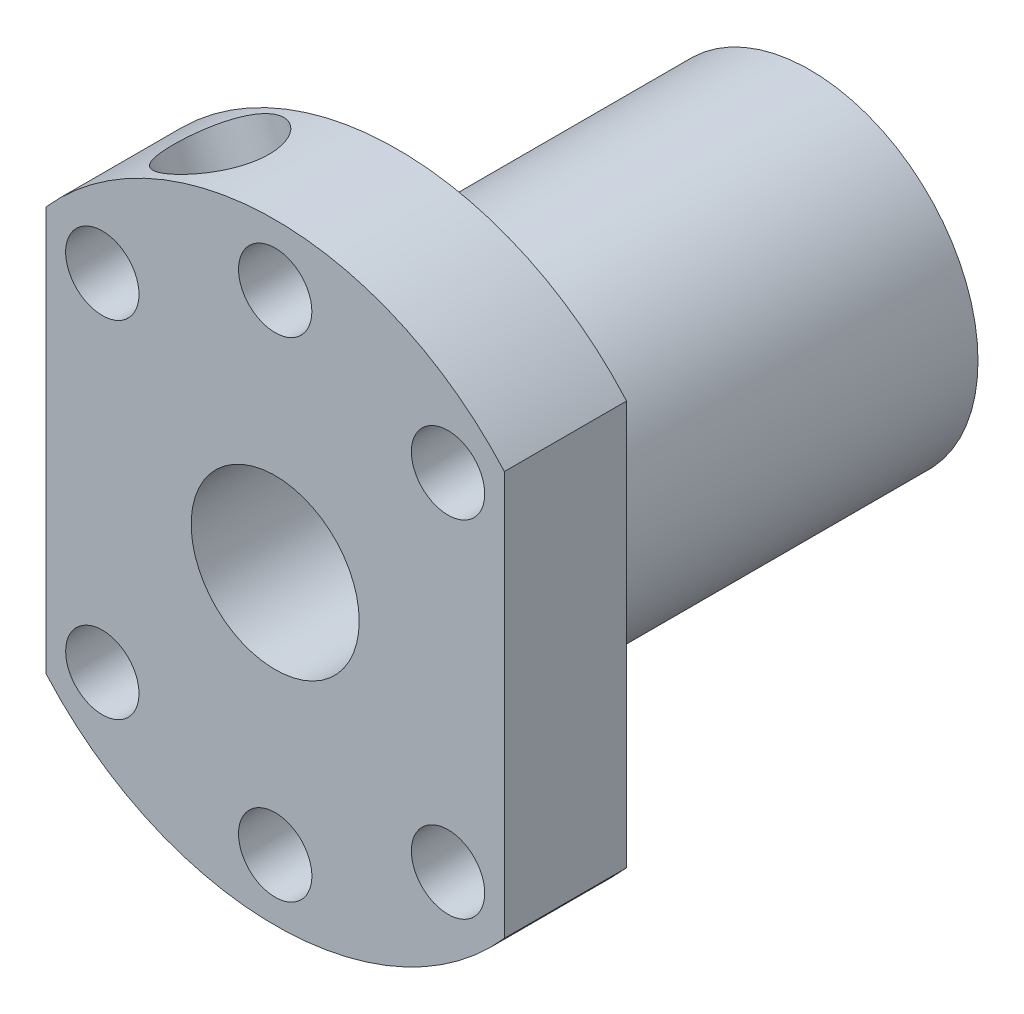
ISO-10303-21;
HEADER;
FILE_DESCRIPTION(('STEP AP214'),'2;1');
FILE_NAME('part.step','',(''),(''),'','','');
FILE_SCHEMA(('AUTOMOTIVE_DESIGN { 1 0 10303 214 1 1 1 1 }'));
ENDSEC;
DATA;
#1=APPLICATION_CONTEXT('core data for automotive mechanical design processes');
#2=APPLICATION_PROTOCOL_DEFINITION('international standard','automotive_design',2000,#1);
#3=PRODUCT_CONTEXT('',#1,'mechanical');
#4=PRODUCT('Part','Part','',(#3));
#5=PRODUCT_RELATED_PRODUCT_CATEGORY('part','',(#4));
#6=PRODUCT_DEFINITION_FORMATION('','',#4);
#7=PRODUCT_DEFINITION_CONTEXT('part definition',#1,'design');
#8=PRODUCT_DEFINITION('design','',#6,#7);
#9=PRODUCT_DEFINITION_SHAPE('','',#8);
#10=(LENGTH_UNIT() NAMED_UNIT(*) SI_UNIT(.MILLI.,.METRE.));
#11=(NAMED_UNIT(*) PLANE_ANGLE_UNIT() SI_UNIT($,.RADIAN.));
#12=(NAMED_UNIT(*) SI_UNIT($,.STERADIAN.) SOLID_ANGLE_UNIT());
#13=UNCERTAINTY_MEASURE_WITH_UNIT(LENGTH_MEASURE(1.E-05),#10,'distance_accuracy_value','');
#14=(GEOMETRIC_REPRESENTATION_CONTEXT(3) GLOBAL_UNCERTAINTY_ASSIGNED_CONTEXT((#13)) GLOBAL_UNIT_ASSIGNED_CONTEXT((#10,
#11,#12)) REPRESENTATION_CONTEXT('',''));
#15=CARTESIAN_POINT('',(0.,0.,0.));
#16=DIRECTION('',(0.,0.,1.));
#17=DIRECTION('',(1.,0.,0.));
#18=AXIS2_PLACEMENT_3D('',#15,#16,#17);
#19=CARTESIAN_POINT('',(0.,0.,-4.));
#20=DIRECTION('',(0.,0.,1.));
#21=DIRECTION('',(1.,0.,0.));
#22=AXIS2_PLACEMENT_3D('',#19,#20,#21);
#23=CYLINDRICAL_SURFACE('',#22,20.);
#24=CARTESIAN_POINT('',(-10.6834527341352,16.9075083225619,0.));
#25=CARTESIAN_POINT('',(-10.6834470694458,16.9075144203462,0.189493070074211));
#26=CARTESIAN_POINT('',(-10.6698245802661,16.9161433725194,0.379088226910409));
#27=CARTESIAN_POINT('',(-10.6156319588622,16.9502018665081,0.75295481575434));
#28=CARTESIAN_POINT('',(-10.5750372792109,16.9756467123783,0.937221238514056));
#29=CARTESIAN_POINT('',(-10.4679065561342,17.0419151459704,1.29496575548327));
#30=CARTESIAN_POINT('',(-10.4013925700306,17.0827256565211,1.46845287771208));
#31=CARTESIAN_POINT('',(-10.2439735364525,17.1775845922552,1.80001657599987));
#32=CARTESIAN_POINT('',(-10.1530711045983,17.2316315977926,1.95809480216016));
#33=CARTESIAN_POINT('',(-9.94797618675826,17.3508480449405,2.25599160663236));
#34=CARTESIAN_POINT('',(-9.83357763278812,17.4161150011035,2.39562931231457));
#35=CARTESIAN_POINT('',(-9.58462142952311,17.5543517557577,2.65110950917119));
#36=CARTESIAN_POINT('',(-9.45006256729773,17.6273220176347,2.76695056764239));
#37=CARTESIAN_POINT('',(-9.16305230768245,17.7782136392605,2.97223024479483));
#38=CARTESIAN_POINT('',(-9.01049483921273,17.8561629680899,3.06150018369731));
#39=CARTESIAN_POINT('',(-8.69200954295635,18.0133413303035,3.21001898120127));
#40=CARTESIAN_POINT('',(-8.52608262020894,18.0925702767745,3.26926986995336));
#41=CARTESIAN_POINT('',(-8.18695253411845,18.2485147299325,3.35551449220158));
#42=CARTESIAN_POINT('',(-8.01383446845415,18.3252470595316,3.38281229682063));
#43=CARTESIAN_POINT('',(-7.66370910909917,18.4744082021136,3.40532168994777));
#44=CARTESIAN_POINT('',(-7.48670209084046,18.5468373185308,3.4005355435212));
#45=CARTESIAN_POINT('',(-7.13578610155158,18.6846391829642,3.35924943005331));
#46=CARTESIAN_POINT('',(-6.96186400111411,18.7500769458634,3.32307672771777));
#47=CARTESIAN_POINT('',(-6.62034366521026,18.8733683364926,3.22055998370278));
#48=CARTESIAN_POINT('',(-6.45274562856819,18.9312217259162,3.15421499428141));
#49=CARTESIAN_POINT('',(-6.12804279733524,19.0388159819683,2.99291378290259));
#50=CARTESIAN_POINT('',(-5.97099155288722,19.0885170619722,2.89782332628046));
#51=CARTESIAN_POINT('',(-5.67294035154719,19.1792088937487,2.68182887728855));
#52=CARTESIAN_POINT('',(-5.53194174644206,19.2201989122175,2.56092271344901));
#53=CARTESIAN_POINT('',(-5.26862887970224,19.2940540084794,2.29491554965888));
#54=CARTESIAN_POINT('',(-5.14657286874375,19.3268100220103,2.14952846863198));
#55=CARTESIAN_POINT('',(-4.92724684606771,19.383888194105,1.8396487129982));
#56=CARTESIAN_POINT('',(-4.82997708126101,19.4082102686541,1.67515584809077));
#57=CARTESIAN_POINT('',(-4.66340877690083,19.4489078057428,1.33140168986874));
#58=CARTESIAN_POINT('',(-4.59414395301674,19.4652736944489,1.15212290614705));
#59=CARTESIAN_POINT('',(-4.48623675183279,19.4904278950091,0.784071452319187));
#60=CARTESIAN_POINT('',(-4.44759156216198,19.4992169027957,0.59529965582722));
#61=CARTESIAN_POINT('',(-4.40263606480386,19.5094163833152,0.216131912408781));
#62=CARTESIAN_POINT('',(-4.39593010244462,19.5109171455052,0.0257852600499826));
#63=CARTESIAN_POINT('',(-4.41402645588413,19.50683093837,-0.353320911076006));
#64=CARTESIAN_POINT('',(-4.43882750330159,19.5012442543649,-0.542080493426127));
#65=CARTESIAN_POINT('',(-4.51875465409513,19.4828771579639,-0.911376680240314));
#66=CARTESIAN_POINT('',(-4.57367913252243,19.4701445621897,-1.09195940860868));
#67=CARTESIAN_POINT('',(-4.71178629401404,19.4371829206116,-1.44124173476254));
#68=CARTESIAN_POINT('',(-4.79497072869138,19.4169534101257,-1.60994059517754));
#69=CARTESIAN_POINT('',(-4.98774189434678,19.3683341861639,-1.93244432755125));
#70=CARTESIAN_POINT('',(-5.09757392488562,19.3398681545568,-2.08609103257745));
#71=CARTESIAN_POINT('',(-5.33966558209419,19.2744301232305,-2.37249181126944));
#72=CARTESIAN_POINT('',(-5.47192685250964,19.2374575000277,-2.50524435231301));
#73=CARTESIAN_POINT('',(-5.75631396708258,19.1542943449529,-2.74755455370419));
#74=CARTESIAN_POINT('',(-5.90863968923127,19.1080081921378,-2.85684504822162));
#75=CARTESIAN_POINT('',(-6.22729827227195,19.0065429636654,-3.0472552957339));
#76=CARTESIAN_POINT('',(-6.39363066585865,18.9513641846372,-3.128375988097));
#77=CARTESIAN_POINT('',(-6.73442712541557,18.832946045367,-3.25973055945808));
#78=CARTESIAN_POINT('',(-6.90885086655723,18.7697443985366,-3.31010292582618));
#79=CARTESIAN_POINT('',(-7.26123791745122,18.6362522311504,-3.37897633227449));
#80=CARTESIAN_POINT('',(-7.43920092235235,18.565962319031,-3.39748010540245));
#81=CARTESIAN_POINT('',(-7.79113018238879,18.4210221489907,-3.40200989952853));
#82=CARTESIAN_POINT('',(-7.96511854692853,18.346437943221,-3.38844195489187));
#83=CARTESIAN_POINT('',(-8.30648776279315,18.1944272367769,-3.33009337565956));
#84=CARTESIAN_POINT('',(-8.47386865481284,18.1170007536134,-3.28531293333043));
#85=CARTESIAN_POINT('',(-8.79735924655007,17.9621440083645,-3.16596872163326));
#86=CARTESIAN_POINT('',(-8.95348225199988,17.8847138626804,-3.09144081540039));
#87=CARTESIAN_POINT('',(-9.25079308184645,17.7327588099485,-2.91476294747449));
#88=CARTESIAN_POINT('',(-9.39198015178331,17.6582340497805,-2.8126115913623));
#89=CARTESIAN_POINT('',(-9.65768032642207,17.514346743923,-2.58215340803367));
#90=CARTESIAN_POINT('',(-9.78197504556622,17.4450561722986,-2.45354982967578));
#91=CARTESIAN_POINT('',(-10.0090427708334,17.315778308672,-2.17445967392011));
#92=CARTESIAN_POINT('',(-10.1118107286066,17.2557931997947,-2.0239679774177));
#93=CARTESIAN_POINT('',(-10.2941237916125,17.1476635666425,-1.70405031804503));
#94=CARTESIAN_POINT('',(-10.3734915651908,17.0996098728753,-1.53449258045895));
#95=CARTESIAN_POINT('',(-10.5060443615718,17.0184935236031,-1.18220552599708));
#96=CARTESIAN_POINT('',(-10.5592553239896,16.9854160188467,-0.999489465244497));
#97=CARTESIAN_POINT('',(-10.6268892478657,16.9431485372812,-0.680072314479715));
#98=CARTESIAN_POINT('',(-10.6480726468449,16.9298207371023,-0.545296195637009));
#99=CARTESIAN_POINT('',(-10.6763562993134,16.9119985130938,-0.273697779400508));
#100=CARTESIAN_POINT('',(-10.6834568258802,16.9075039179817,-0.136875521734732));
#101=CARTESIAN_POINT('',(-10.6834527341352,16.9075083225619,0.));
#102=B_SPLINE_CURVE_WITH_KNOTS('',3,(#24,#25,#26,#27,#28,#29,#30,#31,#32,#33,#34,#35,#36,#37,
#38,#39,#40,#41,#42,#43,#44,#45,#46,#47,#48,#49,#50,#51,#52,#53,#54,#55,#56,#57,#58,#59,#60,#61,
#62,#63,#64,#65,#66,#67,#68,#69,#70,#71,#72,#73,#74,#75,#76,#77,#78,#79,#80,#81,#82,#83,#84,#85,
#86,#87,#88,#89,#90,#91,#92,#93,#94,#95,#96,#97,#98,#99,#100,#101),.UNSPECIFIED.,.T.,.F.,(4,2,2,
2,2,2,2,2,2,2,2,2,2,2,2,2,2,2,2,2,2,2,2,2,2,2,2,2,2,2,2,2,2,2,2,2,2,2,4),(0.,0.567978626740405,
1.13647488094909,1.70448839783965,2.27244102056123,2.84560550067482,3.41880447867669,
3.99556823755995,4.57229298542717,5.14348371475883,5.71463411954627,6.27989979736727,
6.84518323197888,7.41314829255998,7.98116114594951,8.55634227566912,9.13152913489292,
9.70740642494427,10.2832308153314,10.8519031601932,11.4205526126726,11.985441572223,
12.5503655511993,13.1207015003044,13.6910792650367,14.2676428594979,14.8441872256542,
15.4181153565182,15.9919942649047,16.5586467387674,17.1252957221263,17.6912636146944,
18.2572600823985,18.8299911133594,19.4028563083746,19.9799573480927,20.5564849183714,
20.9667578553519,21.377022836751),.UNSPECIFIED.);
#103=CARTESIAN_POINT('',(-10.6834527341352,16.9075083225619,0.));
#104=VERTEX_POINT('',#103);
#105=EDGE_CURVE('E12',#104,#104,#102,.T.);
#106=ORIENTED_EDGE('',*,*,#105,.F.);
#107=EDGE_LOOP('',(#106));
#108=FACE_BOUND('',#107,.T.);
#109=CARTESIAN_POINT('',(0.,0.,4.));
#110=DIRECTION('',(0.,0.,1.));
#111=DIRECTION('',(1.,0.,0.));
#112=AXIS2_PLACEMENT_3D('',#109,#110,#111);
#113=CIRCLE('',#112,20.);
#114=CARTESIAN_POINT('',(15.,13.228756555323,4.));
#115=VERTEX_POINT('',#114);
#116=CARTESIAN_POINT('',(-15.,13.228756555323,4.));
#117=VERTEX_POINT('',#116);
#118=EDGE_CURVE('E187',#115,#117,#113,.T.);
#119=ORIENTED_EDGE('',*,*,#118,.F.);
#120=DIRECTION('',(0.,0.,1.));
#121=VECTOR('',#120,1.);
#122=CARTESIAN_POINT('',(15.,13.228756555323,-4.));
#123=LINE('',#122,#121);
#124=CARTESIAN_POINT('',(15.,13.228756555323,-4.));
#125=VERTEX_POINT('',#124);
#126=EDGE_CURVE('E73',#125,#115,#123,.T.);
#127=ORIENTED_EDGE('',*,*,#126,.F.);
#128=CARTESIAN_POINT('',(0.,0.,-4.));
#129=DIRECTION('',(0.,0.,1.));
#130=DIRECTION('',(1.,0.,0.));
#131=AXIS2_PLACEMENT_3D('',#128,#129,#130);
#132=CIRCLE('',#131,20.);
#133=CARTESIAN_POINT('',(-15.,13.228756555323,-4.));
#134=VERTEX_POINT('',#133);
#135=EDGE_CURVE('E188',#125,#134,#132,.T.);
#136=ORIENTED_EDGE('',*,*,#135,.T.);
#137=DIRECTION('',(0.,0.,1.));
#138=VECTOR('',#137,1.);
#139=CARTESIAN_POINT('',(-15.,13.228756555323,-4.));
#140=LINE('',#139,#138);
#141=EDGE_CURVE('E105',#134,#117,#140,.T.);
#142=ORIENTED_EDGE('',*,*,#141,.T.);
#143=EDGE_LOOP('',(#119,#127,#136,#142));
#144=FACE_BOUND('',#143,.T.);
#145=ADVANCED_FACE('F48',(#108,#144),#23,.T.);
#146=CARTESIAN_POINT('',(15.,13.228756555323,-4.));
#147=DIRECTION('',(1.,0.,0.));
#148=DIRECTION('',(0.,1.,0.));
#149=AXIS2_PLACEMENT_3D('',#146,#147,#148);
#150=PLANE('',#149);
#151=DIRECTION('',(0.,1.,0.));
#152=VECTOR('',#151,1.);
#153=CARTESIAN_POINT('',(15.,13.228756555323,4.));
#154=LINE('',#153,#152);
#155=CARTESIAN_POINT('',(15.,-13.228756555323,4.));
#156=VERTEX_POINT('',#155);
#157=EDGE_CURVE('E192',#156,#115,#154,.T.);
#158=ORIENTED_EDGE('',*,*,#157,.F.);
#159=DIRECTION('',(0.,0.,1.));
#160=VECTOR('',#159,1.);
#161=CARTESIAN_POINT('',(15.,-13.228756555323,-4.));
#162=LINE('',#161,#160);
#163=CARTESIAN_POINT('',(15.,-13.228756555323,-4.));
#164=VERTEX_POINT('',#163);
#165=EDGE_CURVE('E93',#164,#156,#162,.T.);
#166=ORIENTED_EDGE('',*,*,#165,.F.);
#167=DIRECTION('',(0.,1.,0.));
#168=VECTOR('',#167,1.);
#169=CARTESIAN_POINT('',(15.,13.228756555323,-4.));
#170=LINE('',#169,#168);
#171=EDGE_CURVE('E197',#164,#125,#170,.T.);
#172=ORIENTED_EDGE('',*,*,#171,.T.);
#173=ORIENTED_EDGE('',*,*,#126,.T.);
#174=EDGE_LOOP('',(#158,#166,#172,#173));
#175=FACE_BOUND('',#174,.T.);
#176=ADVANCED_FACE('F222',(#175),#150,.T.);
#177=CARTESIAN_POINT('',(0.,0.,-4.));
#178=DIRECTION('',(0.,0.,1.));
#179=DIRECTION('',(1.,0.,0.));
#180=AXIS2_PLACEMENT_3D('',#177,#178,#179);
#181=CYLINDRICAL_SURFACE('',#180,20.);
#182=CARTESIAN_POINT('',(0.,0.,4.));
#183=DIRECTION('',(0.,0.,1.));
#184=DIRECTION('',(-1.,0.,0.));
#185=AXIS2_PLACEMENT_3D('',#182,#183,#184);
#186=CIRCLE('',#185,20.);
#187=CARTESIAN_POINT('',(-15.,-13.228756555323,4.));
#188=VERTEX_POINT('',#187);
#189=EDGE_CURVE('E207',#188,#156,#186,.T.);
#190=ORIENTED_EDGE('',*,*,#189,.F.);
#191=DIRECTION('',(0.,0.,1.));
#192=VECTOR('',#191,1.);
#193=CARTESIAN_POINT('',(-15.,-13.228756555323,-4.));
#194=LINE('',#193,#192);
#195=CARTESIAN_POINT('',(-15.,-13.228756555323,-4.));
#196=VERTEX_POINT('',#195);
#197=EDGE_CURVE('E217',#196,#188,#194,.T.);
#198=ORIENTED_EDGE('',*,*,#197,.F.);
#199=CARTESIAN_POINT('',(0.,0.,-4.));
#200=DIRECTION('',(0.,0.,1.));
#201=DIRECTION('',(-1.,0.,0.));
#202=AXIS2_PLACEMENT_3D('',#199,#200,#201);
#203=CIRCLE('',#202,20.);
#204=EDGE_CURVE('E194',#196,#164,#203,.T.);
#205=ORIENTED_EDGE('',*,*,#204,.T.);
#206=ORIENTED_EDGE('',*,*,#165,.T.);
#207=EDGE_LOOP('',(#190,#198,#205,#206));
#208=FACE_BOUND('',#207,.T.);
#209=ADVANCED_FACE('F225',(#208),#181,.T.);
#210=CARTESIAN_POINT('',(-15.,13.228756555323,-4.));
#211=DIRECTION('',(-1.,0.,0.));
#212=DIRECTION('',(0.,-1.,0.));
#213=AXIS2_PLACEMENT_3D('',#210,#211,#212);
#214=PLANE('',#213);
#215=DIRECTION('',(0.,-1.,0.));
#216=VECTOR('',#215,1.);
#217=CARTESIAN_POINT('',(-15.,13.228756555323,4.));
#218=LINE('',#217,#216);
#219=EDGE_CURVE('E203',#117,#188,#218,.T.);
#220=ORIENTED_EDGE('',*,*,#219,.F.);
#221=ORIENTED_EDGE('',*,*,#141,.F.);
#222=DIRECTION('',(0.,-1.,0.));
#223=VECTOR('',#222,1.);
#224=CARTESIAN_POINT('',(-15.,13.228756555323,-4.));
#225=LINE('',#224,#223);
#226=EDGE_CURVE('E191',#134,#196,#225,.T.);
#227=ORIENTED_EDGE('',*,*,#226,.T.);
#228=ORIENTED_EDGE('',*,*,#197,.T.);
#229=EDGE_LOOP('',(#220,#221,#227,#228));
#230=FACE_BOUND('',#229,.T.);
#231=ADVANCED_FACE('F219',(#230),#214,.T.);
#232=CARTESIAN_POINT('',(0.,0.,-4.));
#233=DIRECTION('',(0.,0.,1.));
#234=DIRECTION('',(1.,0.,0.));
#235=AXIS2_PLACEMENT_3D('',#232,#233,#234);
#236=PLANE('',#235);
#237=CARTESIAN_POINT('',(0.,0.,-4.));
#238=DIRECTION('',(0.,0.,-1.));
#239=DIRECTION('',(-1.,0.,0.));
#240=AXIS2_PLACEMENT_3D('',#237,#238,#239);
#241=CIRCLE('',#240,11.);
#242=CARTESIAN_POINT('',(11.,0.,-3.99999999999999));
#243=VERTEX_POINT('',#242);
#244=EDGE_CURVE('E62',#243,#243,#241,.T.);
#245=ORIENTED_EDGE('',*,*,#244,.F.);
#246=EDGE_LOOP('',(#245));
#247=FACE_BOUND('',#246,.T.);
#248=CARTESIAN_POINT('',(-11.3137084989848,-11.3137084989847,-4.));
#249=DIRECTION('',(0.,0.,1.));
#250=DIRECTION('',(-1.,0.,0.));
#251=AXIS2_PLACEMENT_3D('',#248,#249,#250);
#252=CIRCLE('',#251,2.4);
#253=CARTESIAN_POINT('',(-13.7137084989848,-11.3137084989847,-4.));
#254=VERTEX_POINT('',#253);
#255=EDGE_CURVE('E138',#254,#254,#252,.T.);
#256=ORIENTED_EDGE('',*,*,#255,.T.);
#257=EDGE_LOOP('',(#256));
#258=FACE_BOUND('',#257,.T.);
#259=CARTESIAN_POINT('',(0.,-16.,-4.));
#260=DIRECTION('',(0.,0.,1.));
#261=DIRECTION('',(-1.,0.,0.));
#262=AXIS2_PLACEMENT_3D('',#259,#260,#261);
#263=CIRCLE('',#262,2.4);
#264=CARTESIAN_POINT('',(-2.4,-16.,-4.));
#265=VERTEX_POINT('',#264);
#266=EDGE_CURVE('E146',#265,#265,#263,.T.);
#267=ORIENTED_EDGE('',*,*,#266,.T.);
#268=EDGE_LOOP('',(#267));
#269=FACE_BOUND('',#268,.T.);
#270=CARTESIAN_POINT('',(11.3137084989848,-11.3137084989847,-4.));
#271=DIRECTION('',(0.,0.,1.));
#272=DIRECTION('',(1.,0.,0.));
#273=AXIS2_PLACEMENT_3D('',#270,#271,#272);
#274=CIRCLE('',#273,2.4);
#275=CARTESIAN_POINT('',(13.7137084989848,-11.3137084989847,-4.));
#276=VERTEX_POINT('',#275);
#277=EDGE_CURVE('E154',#276,#276,#274,.T.);
#278=ORIENTED_EDGE('',*,*,#277,.T.);
#279=EDGE_LOOP('',(#278));
#280=FACE_BOUND('',#279,.T.);
#281=CARTESIAN_POINT('',(11.3137084989848,11.3137084989847,-4.));
#282=DIRECTION('',(0.,0.,1.));
#283=DIRECTION('',(-1.,0.,0.));
#284=AXIS2_PLACEMENT_3D('',#281,#282,#283);
#285=CIRCLE('',#284,2.4);
#286=CARTESIAN_POINT('',(8.91370849898479,11.3137084989847,-4.));
#287=VERTEX_POINT('',#286);
#288=EDGE_CURVE('E162',#287,#287,#285,.T.);
#289=ORIENTED_EDGE('',*,*,#288,.T.);
#290=EDGE_LOOP('',(#289));
#291=FACE_BOUND('',#290,.T.);
#292=CARTESIAN_POINT('',(0.,16.,-4.));
#293=DIRECTION('',(0.,0.,1.));
#294=DIRECTION('',(1.,0.,0.));
#295=AXIS2_PLACEMENT_3D('',#292,#293,#294);
#296=CIRCLE('',#295,2.4);
#297=CARTESIAN_POINT('',(2.4,16.,-4.));
#298=VERTEX_POINT('',#297);
#299=EDGE_CURVE('E170',#298,#298,#296,.T.);
#300=ORIENTED_EDGE('',*,*,#299,.T.);
#301=EDGE_LOOP('',(#300));
#302=FACE_BOUND('',#301,.T.);
#303=CARTESIAN_POINT('',(-11.3137084989848,11.3137084989847,-4.));
#304=DIRECTION('',(0.,0.,1.));
#305=DIRECTION('',(1.,0.,0.));
#306=AXIS2_PLACEMENT_3D('',#303,#304,#305);
#307=CIRCLE('',#306,2.4);
#308=CARTESIAN_POINT('',(-8.91370849898479,11.3137084989847,-4.));
#309=VERTEX_POINT('',#308);
#310=EDGE_CURVE('E176',#309,#309,#307,.T.);
#311=ORIENTED_EDGE('',*,*,#310,.T.);
#312=EDGE_LOOP('',(#311));
#313=FACE_BOUND('',#312,.T.);
#314=ORIENTED_EDGE('',*,*,#135,.F.);
#315=ORIENTED_EDGE('',*,*,#171,.F.);
#316=ORIENTED_EDGE('',*,*,#204,.F.);
#317=ORIENTED_EDGE('',*,*,#226,.F.);
#318=EDGE_LOOP('',(#314,#315,#316,#317));
#319=FACE_BOUND('',#318,.T.);
#320=ADVANCED_FACE('F227',(#247,#258,#269,#280,#291,#302,#313,#319),#236,.F.);
#321=CARTESIAN_POINT('',(0.,0.,4.));
#322=DIRECTION('',(0.,0.,1.));
#323=DIRECTION('',(1.,0.,0.));
#324=AXIS2_PLACEMENT_3D('',#321,#322,#323);
#325=PLANE('',#324);
#326=CARTESIAN_POINT('',(-11.3137084989848,-11.3137084989847,4.));
#327=DIRECTION('',(0.,0.,1.));
#328=DIRECTION('',(-1.,0.,0.));
#329=AXIS2_PLACEMENT_3D('',#326,#327,#328);
#330=CIRCLE('',#329,2.4);
#331=CARTESIAN_POINT('',(-13.7137084989848,-11.3137084989847,4.));
#332=VERTEX_POINT('',#331);
#333=EDGE_CURVE('E137',#332,#332,#330,.T.);
#334=ORIENTED_EDGE('',*,*,#333,.F.);
#335=EDGE_LOOP('',(#334));
#336=FACE_BOUND('',#335,.T.);
#337=CARTESIAN_POINT('',(0.,-16.,4.));
#338=DIRECTION('',(0.,0.,1.));
#339=DIRECTION('',(-1.,0.,0.));
#340=AXIS2_PLACEMENT_3D('',#337,#338,#339);
#341=CIRCLE('',#340,2.4);
#342=CARTESIAN_POINT('',(-2.4,-16.,4.));
#343=VERTEX_POINT('',#342);
#344=EDGE_CURVE('E142',#343,#343,#341,.T.);
#345=ORIENTED_EDGE('',*,*,#344,.F.);
#346=EDGE_LOOP('',(#345));
#347=FACE_BOUND('',#346,.T.);
#348=CARTESIAN_POINT('',(11.3137084989848,-11.3137084989847,4.));
#349=DIRECTION('',(0.,0.,1.));
#350=DIRECTION('',(1.,0.,0.));
#351=AXIS2_PLACEMENT_3D('',#348,#349,#350);
#352=CIRCLE('',#351,2.4);
#353=CARTESIAN_POINT('',(13.7137084989848,-11.3137084989847,4.));
#354=VERTEX_POINT('',#353);
#355=EDGE_CURVE('E150',#354,#354,#352,.T.);
#356=ORIENTED_EDGE('',*,*,#355,.F.);
#357=EDGE_LOOP('',(#356));
#358=FACE_BOUND('',#357,.T.);
#359=CARTESIAN_POINT('',(11.3137084989848,11.3137084989847,4.));
#360=DIRECTION('',(0.,0.,1.));
#361=DIRECTION('',(-1.,0.,0.));
#362=AXIS2_PLACEMENT_3D('',#359,#360,#361);
#363=CIRCLE('',#362,2.4);
#364=CARTESIAN_POINT('',(8.91370849898479,11.3137084989847,4.));
#365=VERTEX_POINT('',#364);
#366=EDGE_CURVE('E158',#365,#365,#363,.T.);
#367=ORIENTED_EDGE('',*,*,#366,.F.);
#368=EDGE_LOOP('',(#367));
#369=FACE_BOUND('',#368,.T.);
#370=CARTESIAN_POINT('',(0.,16.,4.));
#371=DIRECTION('',(0.,0.,1.));
#372=DIRECTION('',(1.,0.,0.));
#373=AXIS2_PLACEMENT_3D('',#370,#371,#372);
#374=CIRCLE('',#373,2.4);
#375=CARTESIAN_POINT('',(2.4,16.,4.));
#376=VERTEX_POINT('',#375);
#377=EDGE_CURVE('E166',#376,#376,#374,.T.);
#378=ORIENTED_EDGE('',*,*,#377,.F.);
#379=EDGE_LOOP('',(#378));
#380=FACE_BOUND('',#379,.T.);
#381=CARTESIAN_POINT('',(-11.3137084989848,11.3137084989847,4.));
#382=DIRECTION('',(0.,0.,1.));
#383=DIRECTION('',(1.,0.,0.));
#384=AXIS2_PLACEMENT_3D('',#381,#382,#383);
#385=CIRCLE('',#384,2.4);
#386=CARTESIAN_POINT('',(-8.91370849898479,11.3137084989847,4.));
#387=VERTEX_POINT('',#386);
#388=EDGE_CURVE('E173',#387,#387,#385,.T.);
#389=ORIENTED_EDGE('',*,*,#388,.F.);
#390=EDGE_LOOP('',(#389));
#391=FACE_BOUND('',#390,.T.);
#392=CARTESIAN_POINT('',(0.,0.,4.));
#393=DIRECTION('',(0.,0.,1.));
#394=DIRECTION('',(1.,0.,0.));
#395=AXIS2_PLACEMENT_3D('',#392,#393,#394);
#396=CIRCLE('',#395,5.5);
#397=CARTESIAN_POINT('',(5.5,0.,4.));
#398=VERTEX_POINT('',#397);
#399=EDGE_CURVE('E180',#398,#398,#396,.T.);
#400=ORIENTED_EDGE('',*,*,#399,.F.);
#401=EDGE_LOOP('',(#400));
#402=FACE_BOUND('',#401,.T.);
#403=ORIENTED_EDGE('',*,*,#118,.T.);
#404=ORIENTED_EDGE('',*,*,#219,.T.);
#405=ORIENTED_EDGE('',*,*,#189,.T.);
#406=ORIENTED_EDGE('',*,*,#157,.T.);
#407=EDGE_LOOP('',(#403,#404,#405,#406));
#408=FACE_BOUND('',#407,.T.);
#409=ADVANCED_FACE('F221',(#336,#347,#358,#369,#380,#391,#402,#408),#325,.T.);
#410=CARTESIAN_POINT('',(0.,0.,-4.));
#411=DIRECTION('',(0.,0.,1.));
#412=DIRECTION('',(1.,0.,0.));
#413=AXIS2_PLACEMENT_3D('',#410,#411,#412);
#414=CYLINDRICAL_SURFACE('',#413,5.5);
#415=ORIENTED_EDGE('',*,*,#399,.T.);
#416=EDGE_LOOP('',(#415));
#417=FACE_BOUND('',#416,.T.);
#418=CARTESIAN_POINT('',(0.,0.,-31.));
#419=DIRECTION('',(0.,0.,1.));
#420=DIRECTION('',(1.,0.,0.));
#421=AXIS2_PLACEMENT_3D('',#418,#419,#420);
#422=CIRCLE('',#421,5.5);
#423=CARTESIAN_POINT('',(5.5,0.,-31.));
#424=VERTEX_POINT('',#423);
#425=EDGE_CURVE('E128',#424,#424,#422,.T.);
#426=ORIENTED_EDGE('',*,*,#425,.F.);
#427=EDGE_LOOP('',(#426));
#428=FACE_BOUND('',#427,.T.);
#429=ADVANCED_FACE('F234',(#417,#428),#414,.F.);
#430=CARTESIAN_POINT('',(-11.3137084989848,11.3137084989847,-4.));
#431=DIRECTION('',(0.,0.,1.));
#432=DIRECTION('',(1.,0.,0.));
#433=AXIS2_PLACEMENT_3D('',#430,#431,#432);
#434=CYLINDRICAL_SURFACE('',#433,2.4);
#435=ORIENTED_EDGE('',*,*,#310,.F.);
#436=EDGE_LOOP('',(#435));
#437=FACE_BOUND('',#436,.T.);
#438=ORIENTED_EDGE('',*,*,#388,.T.);
#439=EDGE_LOOP('',(#438));
#440=FACE_BOUND('',#439,.T.);
#441=ADVANCED_FACE('F277',(#437,#440),#434,.F.);
#442=CARTESIAN_POINT('',(0.,16.,-4.));
#443=DIRECTION('',(0.,0.,1.));
#444=DIRECTION('',(1.,0.,0.));
#445=AXIS2_PLACEMENT_3D('',#442,#443,#444);
#446=CYLINDRICAL_SURFACE('',#445,2.4);
#447=ORIENTED_EDGE('',*,*,#299,.F.);
#448=EDGE_LOOP('',(#447));
#449=FACE_BOUND('',#448,.T.);
#450=ORIENTED_EDGE('',*,*,#377,.T.);
#451=EDGE_LOOP('',(#450));
#452=FACE_BOUND('',#451,.T.);
#453=ADVANCED_FACE('F274',(#449,#452),#446,.F.);
#454=CARTESIAN_POINT('',(11.3137084989848,11.3137084989847,-4.));
#455=DIRECTION('',(0.,0.,1.));
#456=DIRECTION('',(1.,0.,0.));
#457=AXIS2_PLACEMENT_3D('',#454,#455,#456);
#458=CYLINDRICAL_SURFACE('',#457,2.4);
#459=ORIENTED_EDGE('',*,*,#288,.F.);
#460=EDGE_LOOP('',(#459));
#461=FACE_BOUND('',#460,.T.);
#462=ORIENTED_EDGE('',*,*,#366,.T.);
#463=EDGE_LOOP('',(#462));
#464=FACE_BOUND('',#463,.T.);
#465=ADVANCED_FACE('F270',(#461,#464),#458,.F.);
#466=CARTESIAN_POINT('',(11.3137084989848,-11.3137084989847,-4.));
#467=DIRECTION('',(0.,0.,1.));
#468=DIRECTION('',(1.,0.,0.));
#469=AXIS2_PLACEMENT_3D('',#466,#467,#468);
#470=CYLINDRICAL_SURFACE('',#469,2.4);
#471=ORIENTED_EDGE('',*,*,#277,.F.);
#472=EDGE_LOOP('',(#471));
#473=FACE_BOUND('',#472,.T.);
#474=ORIENTED_EDGE('',*,*,#355,.T.);
#475=EDGE_LOOP('',(#474));
#476=FACE_BOUND('',#475,.T.);
#477=ADVANCED_FACE('F266',(#473,#476),#470,.F.);
#478=CARTESIAN_POINT('',(0.,-16.,-4.));
#479=DIRECTION('',(0.,0.,1.));
#480=DIRECTION('',(1.,0.,0.));
#481=AXIS2_PLACEMENT_3D('',#478,#479,#480);
#482=CYLINDRICAL_SURFACE('',#481,2.4);
#483=ORIENTED_EDGE('',*,*,#266,.F.);
#484=EDGE_LOOP('',(#483));
#485=FACE_BOUND('',#484,.T.);
#486=ORIENTED_EDGE('',*,*,#344,.T.);
#487=EDGE_LOOP('',(#486));
#488=FACE_BOUND('',#487,.T.);
#489=ADVANCED_FACE('F262',(#485,#488),#482,.F.);
#490=CARTESIAN_POINT('',(-11.3137084989848,-11.3137084989847,-4.));
#491=DIRECTION('',(0.,0.,1.));
#492=DIRECTION('',(1.,0.,0.));
#493=AXIS2_PLACEMENT_3D('',#490,#491,#492);
#494=CYLINDRICAL_SURFACE('',#493,2.4);
#495=ORIENTED_EDGE('',*,*,#255,.F.);
#496=EDGE_LOOP('',(#495));
#497=FACE_BOUND('',#496,.T.);
#498=ORIENTED_EDGE('',*,*,#333,.T.);
#499=EDGE_LOOP('',(#498));
#500=FACE_BOUND('',#499,.T.);
#501=ADVANCED_FACE('F255',(#497,#500),#494,.F.);
#502=CARTESIAN_POINT('',(0.,0.,-97.1126983722081));
#503=DIRECTION('',(0.,0.,1.));
#504=DIRECTION('',(1.,0.,0.));
#505=AXIS2_PLACEMENT_3D('',#502,#503,#504);
#506=CYLINDRICAL_SURFACE('',#505,11.);
#507=CARTESIAN_POINT('',(0.,0.,-31.));
#508=DIRECTION('',(0.,0.,1.));
#509=DIRECTION('',(1.,0.,0.));
#510=AXIS2_PLACEMENT_3D('',#507,#508,#509);
#511=CIRCLE('',#510,11.);
#512=CARTESIAN_POINT('',(11.,0.,-31.));
#513=VERTEX_POINT('',#512);
#514=EDGE_CURVE('E122',#513,#513,#511,.T.);
#515=CARTESIAN_POINT('',(11.,0.,-31.));
#516=CARTESIAN_POINT('',(11.,0.,-30.71875));
#517=CARTESIAN_POINT('',(11.,0.,-30.4375));
#518=CARTESIAN_POINT('',(11.,0.,-29.875));
#519=CARTESIAN_POINT('',(11.,0.,-29.59375));
#520=CARTESIAN_POINT('',(11.,0.,-29.03125));
#521=CARTESIAN_POINT('',(11.,0.,-28.75));
#522=CARTESIAN_POINT('',(11.,0.,-28.1875));
#523=CARTESIAN_POINT('',(11.,0.,-27.90625));
#524=CARTESIAN_POINT('',(11.,0.,-27.34375));
#525=CARTESIAN_POINT('',(11.,0.,-27.0625));
#526=CARTESIAN_POINT('',(11.,0.,-26.5));
#527=CARTESIAN_POINT('',(11.,0.,-26.21875));
#528=CARTESIAN_POINT('',(11.,0.,-25.65625));
#529=CARTESIAN_POINT('',(11.,0.,-25.375));
#530=CARTESIAN_POINT('',(11.,0.,-24.8125));
#531=CARTESIAN_POINT('',(11.,0.,-24.53125));
#532=CARTESIAN_POINT('',(11.,0.,-23.96875));
#533=CARTESIAN_POINT('',(11.,0.,-23.6875));
#534=CARTESIAN_POINT('',(11.,0.,-23.125));
#535=CARTESIAN_POINT('',(11.,0.,-22.84375));
#536=CARTESIAN_POINT('',(11.,0.,-22.28125));
#537=CARTESIAN_POINT('',(11.,0.,-22.));
#538=CARTESIAN_POINT('',(11.,0.,-21.4375));
#539=CARTESIAN_POINT('',(11.,0.,-21.15625));
#540=CARTESIAN_POINT('',(11.,0.,-20.59375));
#541=CARTESIAN_POINT('',(11.,0.,-20.3125));
#542=CARTESIAN_POINT('',(11.,0.,-19.75));
#543=CARTESIAN_POINT('',(11.,0.,-19.46875));
#544=CARTESIAN_POINT('',(11.,0.,-18.90625));
#545=CARTESIAN_POINT('',(11.,0.,-18.625));
#546=CARTESIAN_POINT('',(11.,0.,-18.0625));
#547=CARTESIAN_POINT('',(11.,0.,-17.78125));
#548=CARTESIAN_POINT('',(11.,0.,-17.21875));
#549=CARTESIAN_POINT('',(11.,0.,-16.9375));
#550=CARTESIAN_POINT('',(11.,0.,-16.375));
#551=CARTESIAN_POINT('',(11.,0.,-16.09375));
#552=CARTESIAN_POINT('',(11.,0.,-15.53125));
#553=CARTESIAN_POINT('',(11.,0.,-15.25));
#554=CARTESIAN_POINT('',(11.,0.,-14.6875));
#555=CARTESIAN_POINT('',(11.,0.,-14.40625));
#556=CARTESIAN_POINT('',(11.,0.,-13.84375));
#557=CARTESIAN_POINT('',(11.,0.,-13.5625));
#558=CARTESIAN_POINT('',(11.,0.,-13.));
#559=CARTESIAN_POINT('',(11.,0.,-12.71875));
#560=CARTESIAN_POINT('',(11.,0.,-12.15625));
#561=CARTESIAN_POINT('',(11.,0.,-11.875));
#562=CARTESIAN_POINT('',(11.,0.,-11.3125));
#563=CARTESIAN_POINT('',(11.,0.,-11.03125));
#564=CARTESIAN_POINT('',(11.,0.,-10.46875));
#565=CARTESIAN_POINT('',(11.,0.,-10.1875));
#566=CARTESIAN_POINT('',(11.,0.,-9.62499999999999));
#567=CARTESIAN_POINT('',(11.,0.,-9.34374999999999));
#568=CARTESIAN_POINT('',(11.,0.,-8.78124999999999));
#569=CARTESIAN_POINT('',(11.,0.,-8.49999999999999));
#570=CARTESIAN_POINT('',(11.,0.,-7.93749999999999));
#571=CARTESIAN_POINT('',(11.,0.,-7.65624999999999));
#572=CARTESIAN_POINT('',(11.,0.,-7.09374999999999));
#573=CARTESIAN_POINT('',(11.,0.,-6.81249999999999));
#574=CARTESIAN_POINT('',(11.,0.,-6.24999999999999));
#575=CARTESIAN_POINT('',(11.,0.,-5.96874999999999));
#576=CARTESIAN_POINT('',(11.,0.,-5.40625));
#577=CARTESIAN_POINT('',(11.,0.,-5.12499999999999));
#578=CARTESIAN_POINT('',(11.,0.,-4.56249999999999));
#579=CARTESIAN_POINT('',(11.,0.,-4.28124999999999));
#580=CARTESIAN_POINT('',(11.,0.,-3.99999999999999));
#581=B_SPLINE_CURVE_WITH_KNOTS('',3,(#515,#516,#517,#518,#519,#520,#521,#522,#523,#524,#525,
#526,#527,#528,#529,#530,#531,#532,#533,#534,#535,#536,#537,#538,#539,#540,#541,#542,#543,#544,
#545,#546,#547,#548,#549,#550,#551,#552,#553,#554,#555,#556,#557,#558,#559,#560,#561,#562,#563,
#564,#565,#566,#567,#568,#569,#570,#571,#572,#573,#574,#575,#576,#577,#578,#579,#580),
.UNSPECIFIED.,.F.,.F.,(4,2,2,2,2,2,2,2,2,2,2,2,2,2,2,2,2,2,2,2,2,2,2,2,2,2,2,2,2,2,2,2,4),(0.,
0.843750000000004,1.68750000000001,2.53125,3.375,4.21875000000001,5.0625,5.90625,
6.75000000000001,7.59375000000001,8.43750000000001,9.28125000000001,10.125,10.96875,11.8125,
12.65625,13.5,14.34375,15.1875,16.03125,16.875,17.71875,18.5625,19.40625,20.25,21.09375,21.9375,
22.78125,23.625,24.46875,25.3125,26.15625,27.),.UNSPECIFIED.);
#582=EDGE_CURVE('BSEAM252',#513,#243,#581,.T.);
#583=ORIENTED_EDGE('',*,*,#514,.T.);
#584=ORIENTED_EDGE('',*,*,#244,.T.);
#585=ORIENTED_EDGE('',*,*,#582,.T.);
#586=ORIENTED_EDGE('',*,*,#582,.F.);
#587=EDGE_LOOP('',(#583,#585,#584,#586));
#588=FACE_BOUND('',#587,.T.);
#589=ADVANCED_FACE('F252',(#588),#506,.T.);
#590=CARTESIAN_POINT('',(0.,0.,-31.));
#591=DIRECTION('',(0.,0.,1.));
#592=DIRECTION('',(1.,0.,0.));
#593=AXIS2_PLACEMENT_3D('',#590,#591,#592);
#594=PLANE('',#593);
#595=ORIENTED_EDGE('',*,*,#425,.T.);
#596=EDGE_LOOP('',(#595));
#597=FACE_BOUND('',#596,.T.);
#598=ORIENTED_EDGE('',*,*,#514,.F.);
#599=EDGE_LOOP('',(#598));
#600=FACE_BOUND('',#599,.T.);
#601=ADVANCED_FACE('F115',(#597,#600),#594,.F.);
#602=CARTESIAN_POINT('',(-4.59220118838108,11.0865543901354,0.));
#603=DIRECTION('',(-0.38268343236509,0.923879532511287,0.));
#604=DIRECTION('',(-0.923879532511287,-0.38268343236509,0.));
#605=AXIS2_PLACEMENT_3D('',#602,#603,#604);
#606=CONICAL_SURFACE('',#605,3.4,1.02974425867665);
#607=CARTESIAN_POINT('',(-3.81040721456865,9.19913677557592,0.));
#608=VERTEX_POINT('',#607);
#609=VERTEX_LOOP('',#608);
#610=FACE_BOUND('',#609,.T.);
#611=CARTESIAN_POINT('',(-4.59220118838108,11.0865543901354,0.));
#612=DIRECTION('',(-0.38268343236509,0.923879532511287,0.));
#613=DIRECTION('',(-0.923879532511287,-0.38268343236509,0.));
#614=AXIS2_PLACEMENT_3D('',#611,#612,#613);
#615=CIRCLE('',#614,3.4);
#616=CARTESIAN_POINT('',(-7.73339159891946,9.78543072009413,0.));
#617=VERTEX_POINT('',#616);
#618=EDGE_CURVE('E119',#617,#617,#615,.T.);
#619=ORIENTED_EDGE('',*,*,#618,.T.);
#620=EDGE_LOOP('',(#619));
#621=FACE_BOUND('',#620,.T.);
#622=ADVANCED_FACE('F111',(#610,#621),#606,.F.);
#623=CARTESIAN_POINT('',(-7.65366864730181,18.4775906502257,0.));
#624=DIRECTION('',(-0.38268343236509,0.923879532511287,0.));
#625=DIRECTION('',(-0.923879532511287,-0.38268343236509,0.));
#626=AXIS2_PLACEMENT_3D('',#623,#624,#625);
#627=CYLINDRICAL_SURFACE('',#626,3.4);
#628=ORIENTED_EDGE('',*,*,#105,.T.);
#629=EDGE_LOOP('',(#628));
#630=FACE_BOUND('',#629,.T.);
#631=ORIENTED_EDGE('',*,*,#618,.F.);
#632=EDGE_LOOP('',(#631));
#633=FACE_BOUND('',#632,.T.);
#634=ADVANCED_FACE('F114',(#630,#633),#627,.F.);
#635=CLOSED_SHELL('',(#145,#176,#209,#231,#320,#409,#429,#441,#453,#465,#477,#489,#501,#589,
#601,#622,#634));
#636=MANIFOLD_SOLID_BREP('B2',#635);
#637=ADVANCED_BREP_SHAPE_REPRESENTATION('',(#18,#636),#14);
#638=SHAPE_DEFINITION_REPRESENTATION(#9,#637);
ENDSEC;
END-ISO-10303-21;
